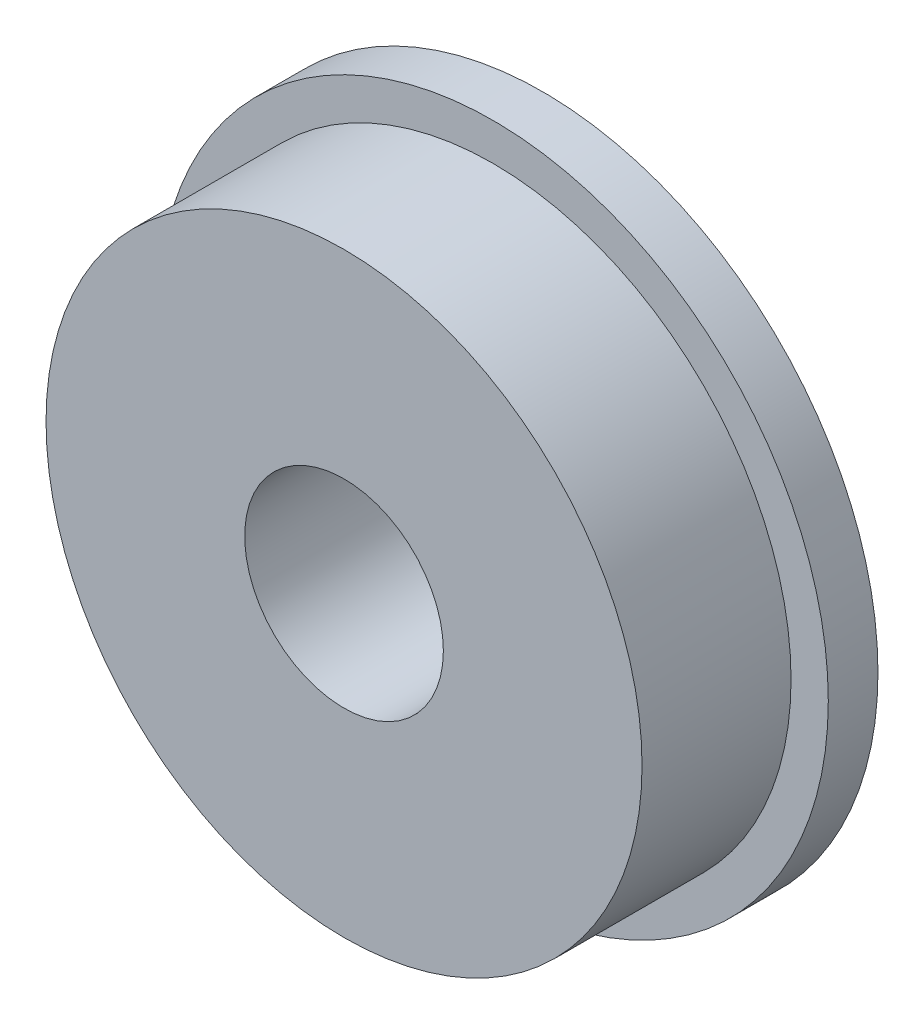
ISO-10303-21;
HEADER;
FILE_DESCRIPTION(('STEP AP214'),'2;1');
FILE_NAME('part.step','',(''),(''),'','','');
FILE_SCHEMA(('AUTOMOTIVE_DESIGN { 1 0 10303 214 1 1 1 1 }'));
ENDSEC;
DATA;
#1=APPLICATION_CONTEXT('core data for automotive mechanical design processes');
#2=APPLICATION_PROTOCOL_DEFINITION('international standard','automotive_design',2000,#1);
#3=PRODUCT_CONTEXT('',#1,'mechanical');
#4=PRODUCT('Part','Part','',(#3));
#5=PRODUCT_RELATED_PRODUCT_CATEGORY('part','',(#4));
#6=PRODUCT_DEFINITION_FORMATION('','',#4);
#7=PRODUCT_DEFINITION_CONTEXT('part definition',#1,'design');
#8=PRODUCT_DEFINITION('design','',#6,#7);
#9=PRODUCT_DEFINITION_SHAPE('','',#8);
#10=(LENGTH_UNIT() NAMED_UNIT(*) SI_UNIT(.MILLI.,.METRE.));
#11=(NAMED_UNIT(*) PLANE_ANGLE_UNIT() SI_UNIT($,.RADIAN.));
#12=(NAMED_UNIT(*) SI_UNIT($,.STERADIAN.) SOLID_ANGLE_UNIT());
#13=UNCERTAINTY_MEASURE_WITH_UNIT(LENGTH_MEASURE(1.E-05),#10,'distance_accuracy_value','');
#14=(GEOMETRIC_REPRESENTATION_CONTEXT(3) GLOBAL_UNCERTAINTY_ASSIGNED_CONTEXT((#13)) GLOBAL_UNIT_ASSIGNED_CONTEXT((#10,
#11,#12)) REPRESENTATION_CONTEXT('',''));
#15=CARTESIAN_POINT('',(0.,0.,0.));
#16=DIRECTION('',(0.,0.,1.));
#17=DIRECTION('',(1.,0.,0.));
#18=AXIS2_PLACEMENT_3D('',#15,#16,#17);
#19=CARTESIAN_POINT('',(0.,0.,4.));
#20=DIRECTION('',(0.,0.,1.));
#21=DIRECTION('',(1.,0.,0.));
#22=AXIS2_PLACEMENT_3D('',#19,#20,#21);
#23=PLANE('',#22);
#24=CARTESIAN_POINT('',(0.,0.,4.));
#25=DIRECTION('',(0.,0.,1.));
#26=DIRECTION('',(1.,0.,0.));
#27=AXIS2_PLACEMENT_3D('',#24,#25,#26);
#28=CIRCLE('',#27,2.);
#29=CARTESIAN_POINT('',(2.,0.,4.));
#30=VERTEX_POINT('',#29);
#31=EDGE_CURVE('E38',#30,#30,#28,.T.);
#32=ORIENTED_EDGE('',*,*,#31,.F.);
#33=EDGE_LOOP('',(#32));
#34=FACE_BOUND('',#33,.T.);
#35=CARTESIAN_POINT('',(0.,0.,4.));
#36=DIRECTION('',(0.,0.,1.));
#37=DIRECTION('',(1.,0.,0.));
#38=AXIS2_PLACEMENT_3D('',#35,#36,#37);
#39=CIRCLE('',#38,6.);
#40=CARTESIAN_POINT('',(6.,0.,4.));
#41=VERTEX_POINT('',#40);
#42=EDGE_CURVE('E52',#41,#41,#39,.T.);
#43=ORIENTED_EDGE('',*,*,#42,.T.);
#44=EDGE_LOOP('',(#43));
#45=FACE_BOUND('',#44,.T.);
#46=ADVANCED_FACE('F31',(#34,#45),#23,.T.);
#47=CARTESIAN_POINT('',(0.,0.,4.));
#48=DIRECTION('',(0.,0.,-1.));
#49=DIRECTION('',(-1.,0.,0.));
#50=AXIS2_PLACEMENT_3D('',#47,#48,#49);
#51=CYLINDRICAL_SURFACE('',#50,6.75);
#52=CARTESIAN_POINT('',(0.,0.,0.));
#53=DIRECTION('',(0.,0.,1.));
#54=DIRECTION('',(1.,0.,0.));
#55=AXIS2_PLACEMENT_3D('',#52,#53,#54);
#56=CIRCLE('',#55,6.75);
#57=CARTESIAN_POINT('',(6.75,0.,0.));
#58=VERTEX_POINT('',#57);
#59=EDGE_CURVE('E10',#58,#58,#56,.T.);
#60=ORIENTED_EDGE('',*,*,#59,.T.);
#61=EDGE_LOOP('',(#60));
#62=FACE_BOUND('',#61,.T.);
#63=CARTESIAN_POINT('',(0.,0.,1.));
#64=DIRECTION('',(0.,0.,1.));
#65=DIRECTION('',(1.,0.,0.));
#66=AXIS2_PLACEMENT_3D('',#63,#64,#65);
#67=CIRCLE('',#66,6.75);
#68=CARTESIAN_POINT('',(6.75,0.,1.));
#69=VERTEX_POINT('',#68);
#70=EDGE_CURVE('E47',#69,#69,#67,.T.);
#71=ORIENTED_EDGE('',*,*,#70,.F.);
#72=EDGE_LOOP('',(#71));
#73=FACE_BOUND('',#72,.T.);
#74=ADVANCED_FACE('F33',(#62,#73),#51,.T.);
#75=CARTESIAN_POINT('',(0.,0.,0.));
#76=DIRECTION('',(0.,0.,1.));
#77=DIRECTION('',(1.,0.,0.));
#78=AXIS2_PLACEMENT_3D('',#75,#76,#77);
#79=PLANE('',#78);
#80=ORIENTED_EDGE('',*,*,#59,.F.);
#81=EDGE_LOOP('',(#80));
#82=FACE_BOUND('',#81,.T.);
#83=CARTESIAN_POINT('',(0.,0.,0.));
#84=DIRECTION('',(0.,0.,1.));
#85=DIRECTION('',(1.,0.,0.));
#86=AXIS2_PLACEMENT_3D('',#83,#84,#85);
#87=CIRCLE('',#86,2.);
#88=CARTESIAN_POINT('',(2.,0.,0.));
#89=VERTEX_POINT('',#88);
#90=EDGE_CURVE('E42',#89,#89,#87,.T.);
#91=ORIENTED_EDGE('',*,*,#90,.T.);
#92=EDGE_LOOP('',(#91));
#93=FACE_BOUND('',#92,.T.);
#94=ADVANCED_FACE('F69',(#82,#93),#79,.F.);
#95=CARTESIAN_POINT('',(0.,0.,4.));
#96=DIRECTION('',(0.,0.,-1.));
#97=DIRECTION('',(-1.,0.,0.));
#98=AXIS2_PLACEMENT_3D('',#95,#96,#97);
#99=CYLINDRICAL_SURFACE('',#98,2.);
#100=ORIENTED_EDGE('',*,*,#31,.T.);
#101=EDGE_LOOP('',(#100));
#102=FACE_BOUND('',#101,.T.);
#103=ORIENTED_EDGE('',*,*,#90,.F.);
#104=EDGE_LOOP('',(#103));
#105=FACE_BOUND('',#104,.T.);
#106=ADVANCED_FACE('F64',(#102,#105),#99,.F.);
#107=CARTESIAN_POINT('',(0.,0.,1.));
#108=DIRECTION('',(0.,0.,1.));
#109=DIRECTION('',(1.,0.,0.));
#110=AXIS2_PLACEMENT_3D('',#107,#108,#109);
#111=PLANE('',#110);
#112=CARTESIAN_POINT('',(0.,0.,1.));
#113=DIRECTION('',(0.,0.,1.));
#114=DIRECTION('',(1.,0.,0.));
#115=AXIS2_PLACEMENT_3D('',#112,#113,#114);
#116=CIRCLE('',#115,6.);
#117=CARTESIAN_POINT('',(6.,0.,1.));
#118=VERTEX_POINT('',#117);
#119=EDGE_CURVE('E51',#118,#118,#116,.T.);
#120=ORIENTED_EDGE('',*,*,#119,.F.);
#121=EDGE_LOOP('',(#120));
#122=FACE_BOUND('',#121,.T.);
#123=ORIENTED_EDGE('',*,*,#70,.T.);
#124=EDGE_LOOP('',(#123));
#125=FACE_BOUND('',#124,.T.);
#126=ADVANCED_FACE('F61',(#122,#125),#111,.T.);
#127=CARTESIAN_POINT('',(0.,0.,1.));
#128=DIRECTION('',(0.,0.,1.));
#129=DIRECTION('',(1.,0.,0.));
#130=AXIS2_PLACEMENT_3D('',#127,#128,#129);
#131=CYLINDRICAL_SURFACE('',#130,6.);
#132=ORIENTED_EDGE('',*,*,#119,.T.);
#133=EDGE_LOOP('',(#132));
#134=FACE_BOUND('',#133,.T.);
#135=ORIENTED_EDGE('',*,*,#42,.F.);
#136=EDGE_LOOP('',(#135));
#137=FACE_BOUND('',#136,.T.);
#138=ADVANCED_FACE('F58',(#134,#137),#131,.T.);
#139=CLOSED_SHELL('',(#46,#74,#94,#106,#126,#138));
#140=MANIFOLD_SOLID_BREP('B2',#139);
#141=ADVANCED_BREP_SHAPE_REPRESENTATION('',(#18,#140),#14);
#142=SHAPE_DEFINITION_REPRESENTATION(#9,#141);
ENDSEC;
END-ISO-10303-21;
